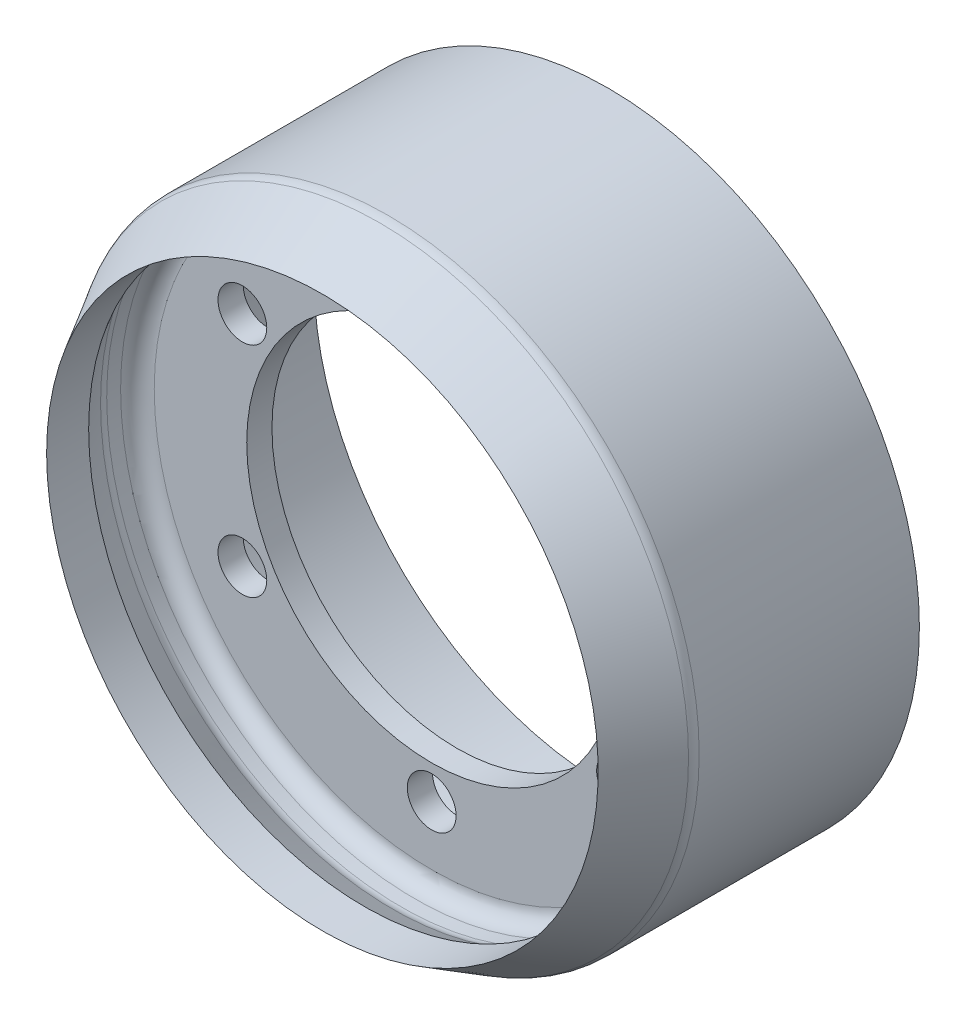
ISO-10303-21;
HEADER;
FILE_DESCRIPTION(('STEP AP214'),'2;1');
FILE_NAME('part.step','',(''),(''),'','','');
FILE_SCHEMA(('AUTOMOTIVE_DESIGN { 1 0 10303 214 1 1 1 1 }'));
ENDSEC;
DATA;
#1=APPLICATION_CONTEXT('core data for automotive mechanical design processes');
#2=APPLICATION_PROTOCOL_DEFINITION('international standard','automotive_design',2000,#1);
#3=PRODUCT_CONTEXT('',#1,'mechanical');
#4=PRODUCT('Part','Part','',(#3));
#5=PRODUCT_RELATED_PRODUCT_CATEGORY('part','',(#4));
#6=PRODUCT_DEFINITION_FORMATION('','',#4);
#7=PRODUCT_DEFINITION_CONTEXT('part definition',#1,'design');
#8=PRODUCT_DEFINITION('design','',#6,#7);
#9=PRODUCT_DEFINITION_SHAPE('','',#8);
#10=(LENGTH_UNIT() NAMED_UNIT(*) SI_UNIT(.MILLI.,.METRE.));
#11=(NAMED_UNIT(*) PLANE_ANGLE_UNIT() SI_UNIT($,.RADIAN.));
#12=(NAMED_UNIT(*) SI_UNIT($,.STERADIAN.) SOLID_ANGLE_UNIT());
#13=UNCERTAINTY_MEASURE_WITH_UNIT(LENGTH_MEASURE(1.E-05),#10,'distance_accuracy_value','');
#14=(GEOMETRIC_REPRESENTATION_CONTEXT(3) GLOBAL_UNCERTAINTY_ASSIGNED_CONTEXT((#13)) GLOBAL_UNIT_ASSIGNED_CONTEXT((#10,
#11,#12)) REPRESENTATION_CONTEXT('',''));
#15=CARTESIAN_POINT('',(0.,0.,0.));
#16=DIRECTION('',(0.,0.,1.));
#17=DIRECTION('',(1.,0.,0.));
#18=AXIS2_PLACEMENT_3D('',#15,#16,#17);
#19=CARTESIAN_POINT('',(0.,0.,0.));
#20=DIRECTION('',(0.,0.,-1.));
#21=DIRECTION('',(-1.,0.,0.));
#22=AXIS2_PLACEMENT_3D('',#19,#20,#21);
#23=CYLINDRICAL_SURFACE('',#22,16.4);
#24=CARTESIAN_POINT('',(0.,0.,5.5));
#25=DIRECTION('',(0.,0.,-1.));
#26=DIRECTION('',(-1.,0.,0.));
#27=AXIS2_PLACEMENT_3D('',#24,#25,#26);
#28=CIRCLE('',#27,16.4);
#29=CARTESIAN_POINT('',(-16.4,0.,5.5));
#30=VERTEX_POINT('',#29);
#31=EDGE_CURVE('E74',#30,#30,#28,.T.);
#32=ORIENTED_EDGE('',*,*,#31,.T.);
#33=EDGE_LOOP('',(#32));
#34=FACE_BOUND('',#33,.T.);
#35=CARTESIAN_POINT('',(0.,0.,8.));
#36=DIRECTION('',(0.,0.,-1.));
#37=DIRECTION('',(-1.,0.,0.));
#38=AXIS2_PLACEMENT_3D('',#35,#36,#37);
#39=CIRCLE('',#38,16.4);
#40=CARTESIAN_POINT('',(-16.4,0.,8.));
#41=VERTEX_POINT('',#40);
#42=EDGE_CURVE('E10',#41,#41,#39,.T.);
#43=ORIENTED_EDGE('',*,*,#42,.F.);
#44=EDGE_LOOP('',(#43));
#45=FACE_BOUND('',#44,.T.);
#46=ADVANCED_FACE('F31',(#34,#45),#23,.F.);
#47=CARTESIAN_POINT('',(0.,0.,4.59474411167424));
#48=DIRECTION('',(0.,0.,-1.));
#49=DIRECTION('',(-1.,0.,0.));
#50=AXIS2_PLACEMENT_3D('',#47,#48,#49);
#51=CONICAL_SURFACE('',#50,18.3660254037844,0.523598775598299);
#52=ORIENTED_EDGE('',*,*,#42,.T.);
#53=EDGE_LOOP('',(#52));
#54=FACE_BOUND('',#53,.T.);
#55=CARTESIAN_POINT('',(0.,0.,4.59474411167424));
#56=DIRECTION('',(0.,0.,-1.));
#57=DIRECTION('',(-1.,0.,0.));
#58=AXIS2_PLACEMENT_3D('',#55,#56,#57);
#59=CIRCLE('',#58,18.3660254037844);
#60=CARTESIAN_POINT('',(-18.3660254037844,0.,4.59474411167424));
#61=VERTEX_POINT('',#60);
#62=EDGE_CURVE('E37',#61,#61,#59,.T.);
#63=ORIENTED_EDGE('',*,*,#62,.F.);
#64=EDGE_LOOP('',(#63));
#65=FACE_BOUND('',#64,.T.);
#66=ADVANCED_FACE('F162',(#54,#65),#51,.T.);
#67=CARTESIAN_POINT('',(0.,0.,4.09474411167424));
#68=DIRECTION('',(0.,0.,-1.));
#69=DIRECTION('',(-1.,0.,0.));
#70=AXIS2_PLACEMENT_3D('',#67,#68,#69);
#71=TOROIDAL_SURFACE('',#70,17.5,1.);
#72=ORIENTED_EDGE('',*,*,#62,.T.);
#73=EDGE_LOOP('',(#72));
#74=FACE_BOUND('',#73,.T.);
#75=CARTESIAN_POINT('',(0.,0.,4.09474411167423));
#76=DIRECTION('',(0.,0.,-1.));
#77=DIRECTION('',(-1.,0.,0.));
#78=AXIS2_PLACEMENT_3D('',#75,#76,#77);
#79=CIRCLE('',#78,18.5);
#80=CARTESIAN_POINT('',(-18.5,0.,4.09474411167423));
#81=VERTEX_POINT('',#80);
#82=EDGE_CURVE('E41',#81,#81,#79,.T.);
#83=ORIENTED_EDGE('',*,*,#82,.F.);
#84=EDGE_LOOP('',(#83));
#85=FACE_BOUND('',#84,.T.);
#86=ADVANCED_FACE('F166',(#74,#85),#71,.T.);
#87=CARTESIAN_POINT('',(0.,0.,0.));
#88=DIRECTION('',(0.,0.,-1.));
#89=DIRECTION('',(-1.,0.,0.));
#90=AXIS2_PLACEMENT_3D('',#87,#88,#89);
#91=CYLINDRICAL_SURFACE('',#90,18.5);
#92=ORIENTED_EDGE('',*,*,#82,.T.);
#93=EDGE_LOOP('',(#92));
#94=FACE_BOUND('',#93,.T.);
#95=CARTESIAN_POINT('',(0.,0.,-9.));
#96=DIRECTION('',(0.,0.,-1.));
#97=DIRECTION('',(-1.,0.,0.));
#98=AXIS2_PLACEMENT_3D('',#95,#96,#97);
#99=CIRCLE('',#98,18.5);
#100=CARTESIAN_POINT('',(-18.5,0.,-9.));
#101=VERTEX_POINT('',#100);
#102=EDGE_CURVE('E45',#101,#101,#99,.T.);
#103=ORIENTED_EDGE('',*,*,#102,.F.);
#104=EDGE_LOOP('',(#103));
#105=FACE_BOUND('',#104,.T.);
#106=ADVANCED_FACE('F170',(#94,#105),#91,.T.);
#107=CARTESIAN_POINT('',(0.,18.5,-9.));
#108=DIRECTION('',(0.,0.,-1.));
#109=DIRECTION('',(-1.,0.,0.));
#110=AXIS2_PLACEMENT_3D('',#107,#108,#109);
#111=PLANE('',#110);
#112=ORIENTED_EDGE('',*,*,#102,.T.);
#113=EDGE_LOOP('',(#112));
#114=FACE_BOUND('',#113,.T.);
#115=CARTESIAN_POINT('',(0.,0.,-9.));
#116=DIRECTION('',(0.,0.,-1.));
#117=DIRECTION('',(-1.,0.,0.));
#118=AXIS2_PLACEMENT_3D('',#115,#116,#117);
#119=CIRCLE('',#118,17.5);
#120=CARTESIAN_POINT('',(-17.5,0.,-9.));
#121=VERTEX_POINT('',#120);
#122=EDGE_CURVE('E50',#121,#121,#119,.T.);
#123=ORIENTED_EDGE('',*,*,#122,.F.);
#124=EDGE_LOOP('',(#123));
#125=FACE_BOUND('',#124,.T.);
#126=ADVANCED_FACE('F176',(#114,#125),#111,.T.);
#127=CARTESIAN_POINT('',(0.,0.,0.));
#128=DIRECTION('',(0.,0.,-1.));
#129=DIRECTION('',(-1.,0.,0.));
#130=AXIS2_PLACEMENT_3D('',#127,#128,#129);
#131=CYLINDRICAL_SURFACE('',#130,17.5);
#132=ORIENTED_EDGE('',*,*,#122,.T.);
#133=EDGE_LOOP('',(#132));
#134=FACE_BOUND('',#133,.T.);
#135=CARTESIAN_POINT('',(0.,0.,0.));
#136=DIRECTION('',(0.,0.,-1.));
#137=DIRECTION('',(-1.,0.,0.));
#138=AXIS2_PLACEMENT_3D('',#135,#136,#137);
#139=CIRCLE('',#138,17.5);
#140=CARTESIAN_POINT('',(-17.5,0.,0.));
#141=VERTEX_POINT('',#140);
#142=EDGE_CURVE('E53',#141,#141,#139,.T.);
#143=ORIENTED_EDGE('',*,*,#142,.F.);
#144=EDGE_LOOP('',(#143));
#145=FACE_BOUND('',#144,.T.);
#146=ADVANCED_FACE('F180',(#134,#145),#131,.F.);
#147=CARTESIAN_POINT('',(0.,17.5,0.));
#148=DIRECTION('',(0.,0.,-1.));
#149=DIRECTION('',(-1.,0.,0.));
#150=AXIS2_PLACEMENT_3D('',#147,#148,#149);
#151=PLANE('',#150);
#152=CARTESIAN_POINT('',(-11.2583302491976,6.50000000000013,0.));
#153=DIRECTION('',(0.,0.,-1.));
#154=DIRECTION('',(-1.,0.,0.));
#155=AXIS2_PLACEMENT_3D('',#152,#153,#154);
#156=CIRCLE('',#155,1.45);
#157=CARTESIAN_POINT('',(-12.7083302491976,6.50000000000013,0.));
#158=VERTEX_POINT('',#157);
#159=EDGE_CURVE('E107',#158,#158,#156,.T.);
#160=ORIENTED_EDGE('',*,*,#159,.F.);
#161=EDGE_LOOP('',(#160));
#162=FACE_BOUND('',#161,.T.);
#163=CARTESIAN_POINT('',(-11.2583302491978,-6.4999999999999,0.));
#164=DIRECTION('',(0.,0.,-1.));
#165=DIRECTION('',(-1.,0.,0.));
#166=AXIS2_PLACEMENT_3D('',#163,#164,#165);
#167=CIRCLE('',#166,1.45);
#168=CARTESIAN_POINT('',(-12.7083302491978,-6.4999999999999,0.));
#169=VERTEX_POINT('',#168);
#170=EDGE_CURVE('E101',#169,#169,#167,.T.);
#171=ORIENTED_EDGE('',*,*,#170,.F.);
#172=EDGE_LOOP('',(#171));
#173=FACE_BOUND('',#172,.T.);
#174=CARTESIAN_POINT('',(0.,-13.,0.));
#175=DIRECTION('',(0.,0.,-1.));
#176=DIRECTION('',(-1.,0.,0.));
#177=AXIS2_PLACEMENT_3D('',#174,#175,#176);
#178=CIRCLE('',#177,1.45);
#179=CARTESIAN_POINT('',(-1.45,-13.,0.));
#180=VERTEX_POINT('',#179);
#181=EDGE_CURVE('E95',#180,#180,#178,.T.);
#182=ORIENTED_EDGE('',*,*,#181,.F.);
#183=EDGE_LOOP('',(#182));
#184=FACE_BOUND('',#183,.T.);
#185=CARTESIAN_POINT('',(11.2583302491977,-6.50000000000005,0.));
#186=DIRECTION('',(0.,0.,-1.));
#187=DIRECTION('',(-1.,0.,0.));
#188=AXIS2_PLACEMENT_3D('',#185,#186,#187);
#189=CIRCLE('',#188,1.45);
#190=CARTESIAN_POINT('',(9.80833024919768,-6.50000000000005,0.));
#191=VERTEX_POINT('',#190);
#192=EDGE_CURVE('E89',#191,#191,#189,.T.);
#193=ORIENTED_EDGE('',*,*,#192,.F.);
#194=EDGE_LOOP('',(#193));
#195=FACE_BOUND('',#194,.T.);
#196=CARTESIAN_POINT('',(11.2583302491977,6.49999999999997,0.));
#197=DIRECTION('',(0.,0.,-1.));
#198=DIRECTION('',(-1.,0.,0.));
#199=AXIS2_PLACEMENT_3D('',#196,#197,#198);
#200=CIRCLE('',#199,1.45);
#201=CARTESIAN_POINT('',(9.80833024919772,6.49999999999997,0.));
#202=VERTEX_POINT('',#201);
#203=EDGE_CURVE('E83',#202,#202,#200,.T.);
#204=ORIENTED_EDGE('',*,*,#203,.F.);
#205=EDGE_LOOP('',(#204));
#206=FACE_BOUND('',#205,.T.);
#207=CARTESIAN_POINT('',(0.,13.,0.));
#208=DIRECTION('',(0.,0.,-1.));
#209=DIRECTION('',(-1.,0.,0.));
#210=AXIS2_PLACEMENT_3D('',#207,#208,#209);
#211=CIRCLE('',#210,1.45);
#212=CARTESIAN_POINT('',(-1.45,13.,0.));
#213=VERTEX_POINT('',#212);
#214=EDGE_CURVE('E77',#213,#213,#211,.T.);
#215=ORIENTED_EDGE('',*,*,#214,.F.);
#216=EDGE_LOOP('',(#215));
#217=FACE_BOUND('',#216,.T.);
#218=ORIENTED_EDGE('',*,*,#142,.T.);
#219=EDGE_LOOP('',(#218));
#220=FACE_BOUND('',#219,.T.);
#221=CARTESIAN_POINT('',(0.,0.,0.));
#222=DIRECTION('',(0.,0.,-1.));
#223=DIRECTION('',(-1.,0.,0.));
#224=AXIS2_PLACEMENT_3D('',#221,#222,#223);
#225=CIRCLE('',#224,11.);
#226=CARTESIAN_POINT('',(-11.,0.,0.));
#227=VERTEX_POINT('',#226);
#228=EDGE_CURVE('E56',#227,#227,#225,.T.);
#229=ORIENTED_EDGE('',*,*,#228,.F.);
#230=EDGE_LOOP('',(#229));
#231=FACE_BOUND('',#230,.T.);
#232=ADVANCED_FACE('F184',(#162,#173,#184,#195,#206,#217,#220,#231),#151,.T.);
#233=CARTESIAN_POINT('',(0.,0.,0.));
#234=DIRECTION('',(0.,0.,-1.));
#235=DIRECTION('',(-1.,0.,0.));
#236=AXIS2_PLACEMENT_3D('',#233,#234,#235);
#237=CYLINDRICAL_SURFACE('',#236,11.);
#238=ORIENTED_EDGE('',*,*,#228,.T.);
#239=EDGE_LOOP('',(#238));
#240=FACE_BOUND('',#239,.T.);
#241=CARTESIAN_POINT('',(0.,0.,1.5));
#242=DIRECTION('',(0.,0.,-1.));
#243=DIRECTION('',(-1.,0.,0.));
#244=AXIS2_PLACEMENT_3D('',#241,#242,#243);
#245=CIRCLE('',#244,11.);
#246=CARTESIAN_POINT('',(-11.,0.,1.5));
#247=VERTEX_POINT('',#246);
#248=EDGE_CURVE('E59',#247,#247,#245,.T.);
#249=ORIENTED_EDGE('',*,*,#248,.F.);
#250=EDGE_LOOP('',(#249));
#251=FACE_BOUND('',#250,.T.);
#252=ADVANCED_FACE('F120',(#240,#251),#237,.F.);
#253=CARTESIAN_POINT('',(0.,11.,1.5));
#254=DIRECTION('',(0.,0.,1.));
#255=DIRECTION('',(1.,0.,0.));
#256=AXIS2_PLACEMENT_3D('',#253,#254,#255);
#257=PLANE('',#256);
#258=CARTESIAN_POINT('',(-11.2583302491976,6.50000000000013,1.5));
#259=DIRECTION('',(0.,0.,1.));
#260=DIRECTION('',(1.,0.,0.));
#261=AXIS2_PLACEMENT_3D('',#258,#259,#260);
#262=CIRCLE('',#261,1.45);
#263=CARTESIAN_POINT('',(-9.80833024919763,6.50000000000013,1.5));
#264=VERTEX_POINT('',#263);
#265=EDGE_CURVE('E110',#264,#264,#262,.T.);
#266=ORIENTED_EDGE('',*,*,#265,.F.);
#267=EDGE_LOOP('',(#266));
#268=FACE_BOUND('',#267,.T.);
#269=CARTESIAN_POINT('',(-11.2583302491978,-6.4999999999999,1.5));
#270=DIRECTION('',(0.,0.,1.));
#271=DIRECTION('',(1.,0.,0.));
#272=AXIS2_PLACEMENT_3D('',#269,#270,#271);
#273=CIRCLE('',#272,1.45);
#274=CARTESIAN_POINT('',(-9.80833024919777,-6.4999999999999,1.5));
#275=VERTEX_POINT('',#274);
#276=EDGE_CURVE('E104',#275,#275,#273,.T.);
#277=ORIENTED_EDGE('',*,*,#276,.F.);
#278=EDGE_LOOP('',(#277));
#279=FACE_BOUND('',#278,.T.);
#280=CARTESIAN_POINT('',(0.,-13.,1.5));
#281=DIRECTION('',(0.,0.,1.));
#282=DIRECTION('',(1.,0.,0.));
#283=AXIS2_PLACEMENT_3D('',#280,#281,#282);
#284=CIRCLE('',#283,1.45);
#285=CARTESIAN_POINT('',(1.45,-13.,1.5));
#286=VERTEX_POINT('',#285);
#287=EDGE_CURVE('E98',#286,#286,#284,.T.);
#288=ORIENTED_EDGE('',*,*,#287,.F.);
#289=EDGE_LOOP('',(#288));
#290=FACE_BOUND('',#289,.T.);
#291=CARTESIAN_POINT('',(11.2583302491977,-6.50000000000005,1.5));
#292=DIRECTION('',(0.,0.,1.));
#293=DIRECTION('',(1.,0.,0.));
#294=AXIS2_PLACEMENT_3D('',#291,#292,#293);
#295=CIRCLE('',#294,1.45);
#296=CARTESIAN_POINT('',(12.7083302491977,-6.50000000000005,1.5));
#297=VERTEX_POINT('',#296);
#298=EDGE_CURVE('E92',#297,#297,#295,.T.);
#299=ORIENTED_EDGE('',*,*,#298,.F.);
#300=EDGE_LOOP('',(#299));
#301=FACE_BOUND('',#300,.T.);
#302=CARTESIAN_POINT('',(11.2583302491977,6.49999999999997,1.5));
#303=DIRECTION('',(0.,0.,1.));
#304=DIRECTION('',(1.,0.,0.));
#305=AXIS2_PLACEMENT_3D('',#302,#303,#304);
#306=CIRCLE('',#305,1.45);
#307=CARTESIAN_POINT('',(12.7083302491977,6.49999999999997,1.5));
#308=VERTEX_POINT('',#307);
#309=EDGE_CURVE('E86',#308,#308,#306,.T.);
#310=ORIENTED_EDGE('',*,*,#309,.F.);
#311=EDGE_LOOP('',(#310));
#312=FACE_BOUND('',#311,.T.);
#313=CARTESIAN_POINT('',(0.,13.,1.5));
#314=DIRECTION('',(0.,0.,1.));
#315=DIRECTION('',(1.,0.,0.));
#316=AXIS2_PLACEMENT_3D('',#313,#314,#315);
#317=CIRCLE('',#316,1.45);
#318=CARTESIAN_POINT('',(1.45,13.,1.5));
#319=VERTEX_POINT('',#318);
#320=EDGE_CURVE('E80',#319,#319,#317,.T.);
#321=ORIENTED_EDGE('',*,*,#320,.F.);
#322=EDGE_LOOP('',(#321));
#323=FACE_BOUND('',#322,.T.);
#324=ORIENTED_EDGE('',*,*,#248,.T.);
#325=EDGE_LOOP('',(#324));
#326=FACE_BOUND('',#325,.T.);
#327=CARTESIAN_POINT('',(0.,0.,1.5));
#328=DIRECTION('',(0.,0.,-1.));
#329=DIRECTION('',(-1.,0.,0.));
#330=AXIS2_PLACEMENT_3D('',#327,#328,#329);
#331=CIRCLE('',#330,16.5);
#332=CARTESIAN_POINT('',(-16.5,0.,1.5));
#333=VERTEX_POINT('',#332);
#334=EDGE_CURVE('E62',#333,#333,#331,.T.);
#335=ORIENTED_EDGE('',*,*,#334,.F.);
#336=EDGE_LOOP('',(#335));
#337=FACE_BOUND('',#336,.T.);
#338=ADVANCED_FACE('F116',(#268,#279,#290,#301,#312,#323,#326,#337),#257,.T.);
#339=CARTESIAN_POINT('',(0.,0.,2.5));
#340=DIRECTION('',(0.,0.,-1.));
#341=DIRECTION('',(-1.,0.,0.));
#342=AXIS2_PLACEMENT_3D('',#339,#340,#341);
#343=TOROIDAL_SURFACE('',#342,16.5,0.999999999999999);
#344=ORIENTED_EDGE('',*,*,#334,.T.);
#345=EDGE_LOOP('',(#344));
#346=FACE_BOUND('',#345,.T.);
#347=CARTESIAN_POINT('',(0.,0.,2.5));
#348=DIRECTION('',(0.,0.,-1.));
#349=DIRECTION('',(-1.,0.,0.));
#350=AXIS2_PLACEMENT_3D('',#347,#348,#349);
#351=CIRCLE('',#350,17.5);
#352=CARTESIAN_POINT('',(-17.5,0.,2.5));
#353=VERTEX_POINT('',#352);
#354=EDGE_CURVE('E65',#353,#353,#351,.T.);
#355=ORIENTED_EDGE('',*,*,#354,.F.);
#356=EDGE_LOOP('',(#355));
#357=FACE_BOUND('',#356,.T.);
#358=ADVANCED_FACE('F119',(#346,#357),#343,.F.);
#359=CARTESIAN_POINT('',(0.,0.,0.));
#360=DIRECTION('',(0.,0.,-1.));
#361=DIRECTION('',(-1.,0.,0.));
#362=AXIS2_PLACEMENT_3D('',#359,#360,#361);
#363=CYLINDRICAL_SURFACE('',#362,17.5);
#364=ORIENTED_EDGE('',*,*,#354,.T.);
#365=EDGE_LOOP('',(#364));
#366=FACE_BOUND('',#365,.T.);
#367=CARTESIAN_POINT('',(0.,0.,3.3267949192431));
#368=DIRECTION('',(0.,0.,-1.));
#369=DIRECTION('',(-1.,0.,0.));
#370=AXIS2_PLACEMENT_3D('',#367,#368,#369);
#371=CIRCLE('',#370,17.5);
#372=CARTESIAN_POINT('',(-17.5,0.,3.3267949192431));
#373=VERTEX_POINT('',#372);
#374=EDGE_CURVE('E68',#373,#373,#371,.T.);
#375=ORIENTED_EDGE('',*,*,#374,.F.);
#376=EDGE_LOOP('',(#375));
#377=FACE_BOUND('',#376,.T.);
#378=ADVANCED_FACE('F138',(#366,#377),#363,.F.);
#379=CARTESIAN_POINT('',(0.,0.,3.32679491924311));
#380=DIRECTION('',(0.,0.,-1.));
#381=DIRECTION('',(-1.,0.,0.));
#382=AXIS2_PLACEMENT_3D('',#379,#380,#381);
#383=TOROIDAL_SURFACE('',#382,16.5,1.);
#384=ORIENTED_EDGE('',*,*,#374,.T.);
#385=EDGE_LOOP('',(#384));
#386=FACE_BOUND('',#385,.T.);
#387=CARTESIAN_POINT('',(0.,0.,3.82679491924312));
#388=DIRECTION('',(0.,0.,-1.));
#389=DIRECTION('',(-1.,0.,0.));
#390=AXIS2_PLACEMENT_3D('',#387,#388,#389);
#391=CIRCLE('',#390,17.3660254037844);
#392=CARTESIAN_POINT('',(-17.3660254037844,0.,3.82679491924312));
#393=VERTEX_POINT('',#392);
#394=EDGE_CURVE('E71',#393,#393,#391,.T.);
#395=ORIENTED_EDGE('',*,*,#394,.F.);
#396=EDGE_LOOP('',(#395));
#397=FACE_BOUND('',#396,.T.);
#398=ADVANCED_FACE('F144',(#386,#397),#383,.F.);
#399=CARTESIAN_POINT('',(0.,0.,5.5));
#400=DIRECTION('',(0.,0.,-1.));
#401=DIRECTION('',(-1.,0.,0.));
#402=AXIS2_PLACEMENT_3D('',#399,#400,#401);
#403=CONICAL_SURFACE('',#402,16.4,0.523598775598304);
#404=ORIENTED_EDGE('',*,*,#394,.T.);
#405=EDGE_LOOP('',(#404));
#406=FACE_BOUND('',#405,.T.);
#407=ORIENTED_EDGE('',*,*,#31,.F.);
#408=EDGE_LOOP('',(#407));
#409=FACE_BOUND('',#408,.T.);
#410=ADVANCED_FACE('F150',(#406,#409),#403,.F.);
#411=CARTESIAN_POINT('',(0.,13.,1.5));
#412=DIRECTION('',(0.,0.,1.));
#413=DIRECTION('',(1.,0.,0.));
#414=AXIS2_PLACEMENT_3D('',#411,#412,#413);
#415=CYLINDRICAL_SURFACE('',#414,1.45);
#416=ORIENTED_EDGE('',*,*,#214,.T.);
#417=EDGE_LOOP('',(#416));
#418=FACE_BOUND('',#417,.T.);
#419=ORIENTED_EDGE('',*,*,#320,.T.);
#420=EDGE_LOOP('',(#419));
#421=FACE_BOUND('',#420,.T.);
#422=ADVANCED_FACE('F156',(#418,#421),#415,.F.);
#423=CARTESIAN_POINT('',(11.2583302491977,6.49999999999997,1.5));
#424=DIRECTION('',(0.,0.,1.));
#425=DIRECTION('',(1.,0.,0.));
#426=AXIS2_PLACEMENT_3D('',#423,#424,#425);
#427=CYLINDRICAL_SURFACE('',#426,1.45);
#428=ORIENTED_EDGE('',*,*,#203,.T.);
#429=EDGE_LOOP('',(#428));
#430=FACE_BOUND('',#429,.T.);
#431=ORIENTED_EDGE('',*,*,#309,.T.);
#432=EDGE_LOOP('',(#431));
#433=FACE_BOUND('',#432,.T.);
#434=ADVANCED_FACE('F194',(#430,#433),#427,.F.);
#435=CARTESIAN_POINT('',(11.2583302491977,-6.50000000000005,1.5));
#436=DIRECTION('',(0.,0.,1.));
#437=DIRECTION('',(1.,0.,0.));
#438=AXIS2_PLACEMENT_3D('',#435,#436,#437);
#439=CYLINDRICAL_SURFACE('',#438,1.45);
#440=ORIENTED_EDGE('',*,*,#192,.T.);
#441=EDGE_LOOP('',(#440));
#442=FACE_BOUND('',#441,.T.);
#443=ORIENTED_EDGE('',*,*,#298,.T.);
#444=EDGE_LOOP('',(#443));
#445=FACE_BOUND('',#444,.T.);
#446=ADVANCED_FACE('F198',(#442,#445),#439,.F.);
#447=CARTESIAN_POINT('',(0.,-13.,1.5));
#448=DIRECTION('',(0.,0.,1.));
#449=DIRECTION('',(1.,0.,0.));
#450=AXIS2_PLACEMENT_3D('',#447,#448,#449);
#451=CYLINDRICAL_SURFACE('',#450,1.45);
#452=ORIENTED_EDGE('',*,*,#181,.T.);
#453=EDGE_LOOP('',(#452));
#454=FACE_BOUND('',#453,.T.);
#455=ORIENTED_EDGE('',*,*,#287,.T.);
#456=EDGE_LOOP('',(#455));
#457=FACE_BOUND('',#456,.T.);
#458=ADVANCED_FACE('F202',(#454,#457),#451,.F.);
#459=CARTESIAN_POINT('',(-11.2583302491978,-6.4999999999999,1.5));
#460=DIRECTION('',(0.,0.,1.));
#461=DIRECTION('',(1.,0.,0.));
#462=AXIS2_PLACEMENT_3D('',#459,#460,#461);
#463=CYLINDRICAL_SURFACE('',#462,1.45);
#464=ORIENTED_EDGE('',*,*,#170,.T.);
#465=EDGE_LOOP('',(#464));
#466=FACE_BOUND('',#465,.T.);
#467=ORIENTED_EDGE('',*,*,#276,.T.);
#468=EDGE_LOOP('',(#467));
#469=FACE_BOUND('',#468,.T.);
#470=ADVANCED_FACE('F206',(#466,#469),#463,.F.);
#471=CARTESIAN_POINT('',(-11.2583302491976,6.50000000000013,1.5));
#472=DIRECTION('',(0.,0.,1.));
#473=DIRECTION('',(1.,0.,0.));
#474=AXIS2_PLACEMENT_3D('',#471,#472,#473);
#475=CYLINDRICAL_SURFACE('',#474,1.45);
#476=ORIENTED_EDGE('',*,*,#159,.T.);
#477=EDGE_LOOP('',(#476));
#478=FACE_BOUND('',#477,.T.);
#479=ORIENTED_EDGE('',*,*,#265,.T.);
#480=EDGE_LOOP('',(#479));
#481=FACE_BOUND('',#480,.T.);
#482=ADVANCED_FACE('F114',(#478,#481),#475,.F.);
#483=CLOSED_SHELL('',(#46,#66,#86,#106,#126,#146,#232,#252,#338,#358,#378,#398,#410,#422,#434,
#446,#458,#470,#482));
#484=MANIFOLD_SOLID_BREP('B2',#483);
#485=ADVANCED_BREP_SHAPE_REPRESENTATION('',(#18,#484),#14);
#486=SHAPE_DEFINITION_REPRESENTATION(#9,#485);
ENDSEC;
END-ISO-10303-21;
